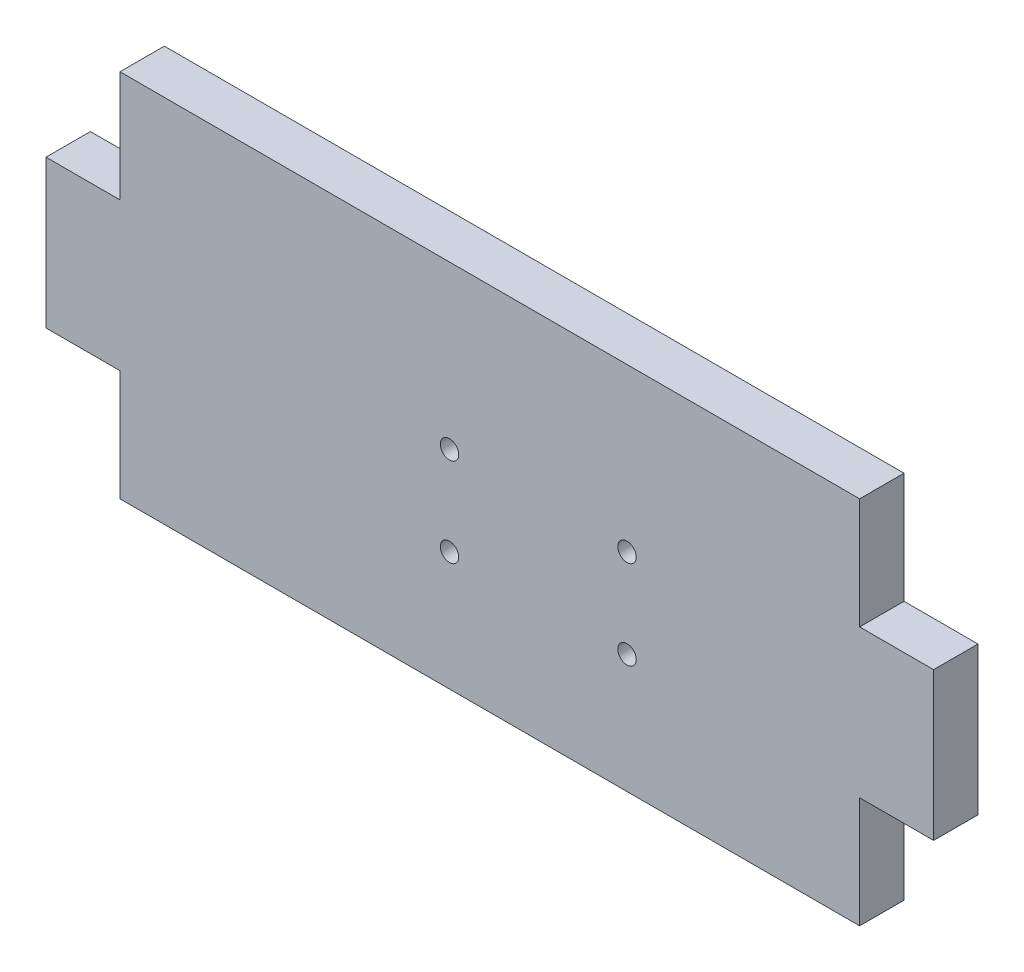
ISO-10303-21;
HEADER;
FILE_DESCRIPTION(('STEP AP214'),'2;1');
FILE_NAME('part.step','',(''),(''),'','','');
FILE_SCHEMA(('AUTOMOTIVE_DESIGN { 1 0 10303 214 1 1 1 1 }'));
ENDSEC;
DATA;
#1=APPLICATION_CONTEXT('core data for automotive mechanical design processes');
#2=APPLICATION_PROTOCOL_DEFINITION('international standard','automotive_design',2000,#1);
#3=PRODUCT_CONTEXT('',#1,'mechanical');
#4=PRODUCT('Part','Part','',(#3));
#5=PRODUCT_RELATED_PRODUCT_CATEGORY('part','',(#4));
#6=PRODUCT_DEFINITION_FORMATION('','',#4);
#7=PRODUCT_DEFINITION_CONTEXT('part definition',#1,'design');
#8=PRODUCT_DEFINITION('design','',#6,#7);
#9=PRODUCT_DEFINITION_SHAPE('','',#8);
#10=(LENGTH_UNIT() NAMED_UNIT(*) SI_UNIT(.MILLI.,.METRE.));
#11=(NAMED_UNIT(*) PLANE_ANGLE_UNIT() SI_UNIT($,.RADIAN.));
#12=(NAMED_UNIT(*) SI_UNIT($,.STERADIAN.) SOLID_ANGLE_UNIT());
#13=UNCERTAINTY_MEASURE_WITH_UNIT(LENGTH_MEASURE(1.E-05),#10,'distance_accuracy_value','');
#14=(GEOMETRIC_REPRESENTATION_CONTEXT(3) GLOBAL_UNCERTAINTY_ASSIGNED_CONTEXT((#13)) GLOBAL_UNIT_ASSIGNED_CONTEXT((#10,
#11,#12)) REPRESENTATION_CONTEXT('',''));
#15=CARTESIAN_POINT('',(0.,0.,0.));
#16=DIRECTION('',(0.,0.,1.));
#17=DIRECTION('',(1.,0.,0.));
#18=AXIS2_PLACEMENT_3D('',#15,#16,#17);
#19=CARTESIAN_POINT('',(0.,35.,6.));
#20=DIRECTION('',(0.,-1.,0.));
#21=DIRECTION('',(0.,0.,-1.));
#22=AXIS2_PLACEMENT_3D('',#19,#20,#21);
#23=PLANE('',#22);
#24=DIRECTION('',(-1.,0.,0.));
#25=VECTOR('',#24,1.);
#26=CARTESIAN_POINT('',(0.,35.,0.));
#27=LINE('',#26,#25);
#28=CARTESIAN_POINT('',(0.,35.,0.));
#29=VERTEX_POINT('',#28);
#30=CARTESIAN_POINT('',(-10.,35.,0.));
#31=VERTEX_POINT('',#30);
#32=EDGE_CURVE('E163',#29,#31,#27,.T.);
#33=ORIENTED_EDGE('',*,*,#32,.T.);
#34=DIRECTION('',(0.,0.,-1.));
#35=VECTOR('',#34,1.);
#36=CARTESIAN_POINT('',(-10.,35.,6.));
#37=LINE('',#36,#35);
#38=CARTESIAN_POINT('',(-10.,35.,6.));
#39=VERTEX_POINT('',#38);
#40=EDGE_CURVE('E11',#39,#31,#37,.T.);
#41=ORIENTED_EDGE('',*,*,#40,.F.);
#42=DIRECTION('',(-1.,0.,0.));
#43=VECTOR('',#42,1.);
#44=CARTESIAN_POINT('',(0.,35.,6.));
#45=LINE('',#44,#43);
#46=CARTESIAN_POINT('',(0.,35.,6.));
#47=VERTEX_POINT('',#46);
#48=EDGE_CURVE('E227',#47,#39,#45,.T.);
#49=ORIENTED_EDGE('',*,*,#48,.F.);
#50=DIRECTION('',(0.,0.,-1.));
#51=VECTOR('',#50,1.);
#52=CARTESIAN_POINT('',(0.,35.,6.));
#53=LINE('',#52,#51);
#54=EDGE_CURVE('E55',#47,#29,#53,.T.);
#55=ORIENTED_EDGE('',*,*,#54,.T.);
#56=EDGE_LOOP('',(#33,#41,#49,#55));
#57=FACE_BOUND('',#56,.T.);
#58=ADVANCED_FACE('F39',(#57),#23,.F.);
#59=CARTESIAN_POINT('',(-10.,0.,6.));
#60=DIRECTION('',(1.,0.,0.));
#61=DIRECTION('',(0.,1.,0.));
#62=AXIS2_PLACEMENT_3D('',#59,#60,#61);
#63=PLANE('',#62);
#64=DIRECTION('',(0.,-1.,0.));
#65=VECTOR('',#64,1.);
#66=CARTESIAN_POINT('',(-10.,0.,0.));
#67=LINE('',#66,#65);
#68=CARTESIAN_POINT('',(-10.,15.,0.));
#69=VERTEX_POINT('',#68);
#70=EDGE_CURVE('E165',#31,#69,#67,.T.);
#71=ORIENTED_EDGE('',*,*,#70,.T.);
#72=DIRECTION('',(0.,0.,-1.));
#73=VECTOR('',#72,1.);
#74=CARTESIAN_POINT('',(-10.,15.,6.));
#75=LINE('',#74,#73);
#76=CARTESIAN_POINT('',(-10.,15.,6.));
#77=VERTEX_POINT('',#76);
#78=EDGE_CURVE('E47',#77,#69,#75,.T.);
#79=ORIENTED_EDGE('',*,*,#78,.F.);
#80=DIRECTION('',(0.,-1.,0.));
#81=VECTOR('',#80,1.);
#82=CARTESIAN_POINT('',(-10.,0.,6.));
#83=LINE('',#82,#81);
#84=EDGE_CURVE('E105',#39,#77,#83,.T.);
#85=ORIENTED_EDGE('',*,*,#84,.F.);
#86=ORIENTED_EDGE('',*,*,#40,.T.);
#87=EDGE_LOOP('',(#71,#79,#85,#86));
#88=FACE_BOUND('',#87,.T.);
#89=ADVANCED_FACE('F213',(#88),#63,.F.);
#90=CARTESIAN_POINT('',(0.,15.,6.));
#91=DIRECTION('',(0.,-1.,0.));
#92=DIRECTION('',(0.,0.,-1.));
#93=AXIS2_PLACEMENT_3D('',#90,#91,#92);
#94=PLANE('',#93);
#95=DIRECTION('',(-1.,0.,0.));
#96=VECTOR('',#95,1.);
#97=CARTESIAN_POINT('',(0.,15.,0.));
#98=LINE('',#97,#96);
#99=CARTESIAN_POINT('',(0.,15.,0.));
#100=VERTEX_POINT('',#99);
#101=EDGE_CURVE('E169',#100,#69,#98,.T.);
#102=ORIENTED_EDGE('',*,*,#101,.F.);
#103=DIRECTION('',(0.,0.,-1.));
#104=VECTOR('',#103,1.);
#105=CARTESIAN_POINT('',(0.,15.,6.));
#106=LINE('',#105,#104);
#107=CARTESIAN_POINT('',(0.,15.,6.));
#108=VERTEX_POINT('',#107);
#109=EDGE_CURVE('E206',#108,#100,#106,.T.);
#110=ORIENTED_EDGE('',*,*,#109,.F.);
#111=DIRECTION('',(-1.,0.,0.));
#112=VECTOR('',#111,1.);
#113=CARTESIAN_POINT('',(0.,15.,6.));
#114=LINE('',#113,#112);
#115=EDGE_CURVE('E212',#108,#77,#114,.T.);
#116=ORIENTED_EDGE('',*,*,#115,.T.);
#117=ORIENTED_EDGE('',*,*,#78,.T.);
#118=EDGE_LOOP('',(#102,#110,#116,#117));
#119=FACE_BOUND('',#118,.T.);
#120=ADVANCED_FACE('F210',(#119),#94,.T.);
#121=CARTESIAN_POINT('',(0.,0.,6.));
#122=DIRECTION('',(-1.,0.,0.));
#123=DIRECTION('',(0.,0.,1.));
#124=AXIS2_PLACEMENT_3D('',#121,#122,#123);
#125=PLANE('',#124);
#126=DIRECTION('',(0.,1.,0.));
#127=VECTOR('',#126,1.);
#128=CARTESIAN_POINT('',(0.,0.,0.));
#129=LINE('',#128,#127);
#130=CARTESIAN_POINT('',(0.,0.,0.));
#131=VERTEX_POINT('',#130);
#132=EDGE_CURVE('E172',#131,#100,#129,.T.);
#133=ORIENTED_EDGE('',*,*,#132,.F.);
#134=DIRECTION('',(0.,0.,-1.));
#135=VECTOR('',#134,1.);
#136=CARTESIAN_POINT('',(0.,0.,6.));
#137=LINE('',#136,#135);
#138=CARTESIAN_POINT('',(0.,0.,6.));
#139=VERTEX_POINT('',#138);
#140=EDGE_CURVE('E204',#139,#131,#137,.T.);
#141=ORIENTED_EDGE('',*,*,#140,.F.);
#142=DIRECTION('',(0.,1.,0.));
#143=VECTOR('',#142,1.);
#144=CARTESIAN_POINT('',(0.,0.,6.));
#145=LINE('',#144,#143);
#146=EDGE_CURVE('E159',#139,#108,#145,.T.);
#147=ORIENTED_EDGE('',*,*,#146,.T.);
#148=ORIENTED_EDGE('',*,*,#109,.T.);
#149=EDGE_LOOP('',(#133,#141,#147,#148));
#150=FACE_BOUND('',#149,.T.);
#151=ADVANCED_FACE('F221',(#150),#125,.T.);
#152=CARTESIAN_POINT('',(0.,0.,6.));
#153=DIRECTION('',(0.,1.,0.));
#154=DIRECTION('',(0.,0.,1.));
#155=AXIS2_PLACEMENT_3D('',#152,#153,#154);
#156=PLANE('',#155);
#157=DIRECTION('',(1.,0.,0.));
#158=VECTOR('',#157,1.);
#159=CARTESIAN_POINT('',(0.,0.,0.));
#160=LINE('',#159,#158);
#161=CARTESIAN_POINT('',(100.,0.,0.));
#162=VERTEX_POINT('',#161);
#163=EDGE_CURVE('E175',#131,#162,#160,.T.);
#164=ORIENTED_EDGE('',*,*,#163,.T.);
#165=DIRECTION('',(0.,0.,-1.));
#166=VECTOR('',#165,1.);
#167=CARTESIAN_POINT('',(100.,0.,6.));
#168=LINE('',#167,#166);
#169=CARTESIAN_POINT('',(100.,0.,6.));
#170=VERTEX_POINT('',#169);
#171=EDGE_CURVE('E201',#170,#162,#168,.T.);
#172=ORIENTED_EDGE('',*,*,#171,.F.);
#173=DIRECTION('',(1.,0.,0.));
#174=VECTOR('',#173,1.);
#175=CARTESIAN_POINT('',(0.,0.,6.));
#176=LINE('',#175,#174);
#177=EDGE_CURVE('E226',#139,#170,#176,.T.);
#178=ORIENTED_EDGE('',*,*,#177,.F.);
#179=ORIENTED_EDGE('',*,*,#140,.T.);
#180=EDGE_LOOP('',(#164,#172,#178,#179));
#181=FACE_BOUND('',#180,.T.);
#182=ADVANCED_FACE('F300',(#181),#156,.F.);
#183=CARTESIAN_POINT('',(100.,0.,6.));
#184=DIRECTION('',(-1.,0.,0.));
#185=DIRECTION('',(0.,0.,1.));
#186=AXIS2_PLACEMENT_3D('',#183,#184,#185);
#187=PLANE('',#186);
#188=DIRECTION('',(0.,1.,0.));
#189=VECTOR('',#188,1.);
#190=CARTESIAN_POINT('',(100.,0.,0.));
#191=LINE('',#190,#189);
#192=CARTESIAN_POINT('',(100.,15.,0.));
#193=VERTEX_POINT('',#192);
#194=EDGE_CURVE('E178',#162,#193,#191,.T.);
#195=ORIENTED_EDGE('',*,*,#194,.T.);
#196=DIRECTION('',(0.,0.,-1.));
#197=VECTOR('',#196,1.);
#198=CARTESIAN_POINT('',(100.,15.,6.));
#199=LINE('',#198,#197);
#200=CARTESIAN_POINT('',(100.,15.,6.));
#201=VERTEX_POINT('',#200);
#202=EDGE_CURVE('E198',#201,#193,#199,.T.);
#203=ORIENTED_EDGE('',*,*,#202,.F.);
#204=DIRECTION('',(0.,1.,0.));
#205=VECTOR('',#204,1.);
#206=CARTESIAN_POINT('',(100.,0.,6.));
#207=LINE('',#206,#205);
#208=EDGE_CURVE('E145',#170,#201,#207,.T.);
#209=ORIENTED_EDGE('',*,*,#208,.F.);
#210=ORIENTED_EDGE('',*,*,#171,.T.);
#211=EDGE_LOOP('',(#195,#203,#209,#210));
#212=FACE_BOUND('',#211,.T.);
#213=ADVANCED_FACE('F303',(#212),#187,.F.);
#214=CARTESIAN_POINT('',(0.,15.,6.));
#215=DIRECTION('',(0.,1.,0.));
#216=DIRECTION('',(0.,0.,1.));
#217=AXIS2_PLACEMENT_3D('',#214,#215,#216);
#218=PLANE('',#217);
#219=DIRECTION('',(1.,0.,0.));
#220=VECTOR('',#219,1.);
#221=CARTESIAN_POINT('',(0.,15.,0.));
#222=LINE('',#221,#220);
#223=CARTESIAN_POINT('',(110.,15.,0.));
#224=VERTEX_POINT('',#223);
#225=EDGE_CURVE('E180',#193,#224,#222,.T.);
#226=ORIENTED_EDGE('',*,*,#225,.T.);
#227=DIRECTION('',(0.,0.,-1.));
#228=VECTOR('',#227,1.);
#229=CARTESIAN_POINT('',(110.,15.,6.));
#230=LINE('',#229,#228);
#231=CARTESIAN_POINT('',(110.,15.,6.));
#232=VERTEX_POINT('',#231);
#233=EDGE_CURVE('E196',#232,#224,#230,.T.);
#234=ORIENTED_EDGE('',*,*,#233,.F.);
#235=DIRECTION('',(1.,0.,0.));
#236=VECTOR('',#235,1.);
#237=CARTESIAN_POINT('',(0.,15.,6.));
#238=LINE('',#237,#236);
#239=EDGE_CURVE('E232',#201,#232,#238,.T.);
#240=ORIENTED_EDGE('',*,*,#239,.F.);
#241=ORIENTED_EDGE('',*,*,#202,.T.);
#242=EDGE_LOOP('',(#226,#234,#240,#241));
#243=FACE_BOUND('',#242,.T.);
#244=ADVANCED_FACE('F305',(#243),#218,.F.);
#245=CARTESIAN_POINT('',(110.,0.,6.));
#246=DIRECTION('',(1.,0.,0.));
#247=DIRECTION('',(0.,0.,-1.));
#248=AXIS2_PLACEMENT_3D('',#245,#246,#247);
#249=PLANE('',#248);
#250=DIRECTION('',(0.,-1.,0.));
#251=VECTOR('',#250,1.);
#252=CARTESIAN_POINT('',(110.,0.,0.));
#253=LINE('',#252,#251);
#254=CARTESIAN_POINT('',(110.,35.,0.));
#255=VERTEX_POINT('',#254);
#256=EDGE_CURVE('E183',#255,#224,#253,.T.);
#257=ORIENTED_EDGE('',*,*,#256,.F.);
#258=DIRECTION('',(0.,0.,-1.));
#259=VECTOR('',#258,1.);
#260=CARTESIAN_POINT('',(110.,35.,6.));
#261=LINE('',#260,#259);
#262=CARTESIAN_POINT('',(110.,35.,6.));
#263=VERTEX_POINT('',#262);
#264=EDGE_CURVE('E194',#263,#255,#261,.T.);
#265=ORIENTED_EDGE('',*,*,#264,.F.);
#266=DIRECTION('',(0.,-1.,0.));
#267=VECTOR('',#266,1.);
#268=CARTESIAN_POINT('',(110.,0.,6.));
#269=LINE('',#268,#267);
#270=EDGE_CURVE('E233',#263,#232,#269,.T.);
#271=ORIENTED_EDGE('',*,*,#270,.T.);
#272=ORIENTED_EDGE('',*,*,#233,.T.);
#273=EDGE_LOOP('',(#257,#265,#271,#272));
#274=FACE_BOUND('',#273,.T.);
#275=ADVANCED_FACE('F308',(#274),#249,.T.);
#276=CARTESIAN_POINT('',(0.,35.,6.));
#277=DIRECTION('',(0.,1.,0.));
#278=DIRECTION('',(0.,0.,1.));
#279=AXIS2_PLACEMENT_3D('',#276,#277,#278);
#280=PLANE('',#279);
#281=DIRECTION('',(1.,0.,0.));
#282=VECTOR('',#281,1.);
#283=CARTESIAN_POINT('',(0.,35.,0.));
#284=LINE('',#283,#282);
#285=CARTESIAN_POINT('',(100.,35.,0.));
#286=VERTEX_POINT('',#285);
#287=EDGE_CURVE('E186',#286,#255,#284,.T.);
#288=ORIENTED_EDGE('',*,*,#287,.F.);
#289=DIRECTION('',(0.,0.,-1.));
#290=VECTOR('',#289,1.);
#291=CARTESIAN_POINT('',(100.,35.,6.));
#292=LINE('',#291,#290);
#293=CARTESIAN_POINT('',(100.,35.,6.));
#294=VERTEX_POINT('',#293);
#295=EDGE_CURVE('E153',#294,#286,#292,.T.);
#296=ORIENTED_EDGE('',*,*,#295,.F.);
#297=DIRECTION('',(1.,0.,0.));
#298=VECTOR('',#297,1.);
#299=CARTESIAN_POINT('',(0.,35.,6.));
#300=LINE('',#299,#298);
#301=EDGE_CURVE('E142',#294,#263,#300,.T.);
#302=ORIENTED_EDGE('',*,*,#301,.T.);
#303=ORIENTED_EDGE('',*,*,#264,.T.);
#304=EDGE_LOOP('',(#288,#296,#302,#303));
#305=FACE_BOUND('',#304,.T.);
#306=ADVANCED_FACE('F238',(#305),#280,.T.);
#307=CARTESIAN_POINT('',(100.,50.,0.));
#308=VERTEX_POINT('',#307);
#309=EDGE_CURVE('E150',#286,#308,#191,.T.);
#310=ORIENTED_EDGE('',*,*,#309,.T.);
#311=DIRECTION('',(0.,0.,-1.));
#312=VECTOR('',#311,1.);
#313=CARTESIAN_POINT('',(100.,50.,6.));
#314=LINE('',#313,#312);
#315=CARTESIAN_POINT('',(100.,50.,6.));
#316=VERTEX_POINT('',#315);
#317=EDGE_CURVE('E147',#316,#308,#314,.T.);
#318=ORIENTED_EDGE('',*,*,#317,.F.);
#319=EDGE_CURVE('E134',#294,#316,#207,.T.);
#320=ORIENTED_EDGE('',*,*,#319,.F.);
#321=ORIENTED_EDGE('',*,*,#295,.T.);
#322=EDGE_LOOP('',(#310,#318,#320,#321));
#323=FACE_BOUND('',#322,.T.);
#324=ADVANCED_FACE('F148',(#323),#187,.F.);
#325=CARTESIAN_POINT('',(0.,50.,6.));
#326=DIRECTION('',(0.,1.,0.));
#327=DIRECTION('',(0.,0.,1.));
#328=AXIS2_PLACEMENT_3D('',#325,#326,#327);
#329=PLANE('',#328);
#330=DIRECTION('',(1.,0.,0.));
#331=VECTOR('',#330,1.);
#332=CARTESIAN_POINT('',(0.,50.,0.));
#333=LINE('',#332,#331);
#334=CARTESIAN_POINT('',(0.,50.,0.));
#335=VERTEX_POINT('',#334);
#336=EDGE_CURVE('E189',#335,#308,#333,.T.);
#337=ORIENTED_EDGE('',*,*,#336,.F.);
#338=DIRECTION('',(0.,0.,-1.));
#339=VECTOR('',#338,1.);
#340=CARTESIAN_POINT('',(0.,50.,6.));
#341=LINE('',#340,#339);
#342=CARTESIAN_POINT('',(0.,50.,6.));
#343=VERTEX_POINT('',#342);
#344=EDGE_CURVE('E93',#343,#335,#341,.T.);
#345=ORIENTED_EDGE('',*,*,#344,.F.);
#346=DIRECTION('',(1.,0.,0.));
#347=VECTOR('',#346,1.);
#348=CARTESIAN_POINT('',(0.,50.,6.));
#349=LINE('',#348,#347);
#350=EDGE_CURVE('E139',#343,#316,#349,.T.);
#351=ORIENTED_EDGE('',*,*,#350,.T.);
#352=ORIENTED_EDGE('',*,*,#317,.T.);
#353=EDGE_LOOP('',(#337,#345,#351,#352));
#354=FACE_BOUND('',#353,.T.);
#355=ADVANCED_FACE('F155',(#354),#329,.T.);
#356=EDGE_CURVE('E176',#29,#335,#129,.T.);
#357=ORIENTED_EDGE('',*,*,#356,.F.);
#358=ORIENTED_EDGE('',*,*,#54,.F.);
#359=EDGE_CURVE('E156',#47,#343,#145,.T.);
#360=ORIENTED_EDGE('',*,*,#359,.T.);
#361=ORIENTED_EDGE('',*,*,#344,.T.);
#362=EDGE_LOOP('',(#357,#358,#360,#361));
#363=FACE_BOUND('',#362,.T.);
#364=ADVANCED_FACE('F282',(#363),#125,.T.);
#365=CARTESIAN_POINT('',(0.,0.,6.));
#366=DIRECTION('',(0.,0.,1.));
#367=DIRECTION('',(1.,0.,0.));
#368=AXIS2_PLACEMENT_3D('',#365,#366,#367);
#369=PLANE('',#368);
#370=CARTESIAN_POINT('',(68.550340057059,16.0653133446784,6.));
#371=DIRECTION('',(0.,0.,1.));
#372=DIRECTION('',(1.,0.,0.));
#373=AXIS2_PLACEMENT_3D('',#370,#371,#372);
#374=CIRCLE('',#373,1.25);
#375=CARTESIAN_POINT('',(69.800340057059,16.0653133446784,6.));
#376=VERTEX_POINT('',#375);
#377=EDGE_CURVE('E248',#376,#376,#374,.F.);
#378=ORIENTED_EDGE('',*,*,#377,.T.);
#379=EDGE_LOOP('',(#378));
#380=FACE_BOUND('',#379,.T.);
#381=CARTESIAN_POINT('',(68.550340057059,28.0653133446784,6.));
#382=DIRECTION('',(0.,0.,1.));
#383=DIRECTION('',(1.,0.,0.));
#384=AXIS2_PLACEMENT_3D('',#381,#382,#383);
#385=CIRCLE('',#384,1.25);
#386=CARTESIAN_POINT('',(69.800340057059,28.0653133446784,6.));
#387=VERTEX_POINT('',#386);
#388=EDGE_CURVE('E255',#387,#387,#385,.F.);
#389=ORIENTED_EDGE('',*,*,#388,.T.);
#390=EDGE_LOOP('',(#389));
#391=FACE_BOUND('',#390,.T.);
#392=CARTESIAN_POINT('',(44.550340057059,28.0653133446784,6.));
#393=DIRECTION('',(0.,0.,1.));
#394=DIRECTION('',(1.,0.,0.));
#395=AXIS2_PLACEMENT_3D('',#392,#393,#394);
#396=CIRCLE('',#395,1.25);
#397=CARTESIAN_POINT('',(45.800340057059,28.0653133446784,6.));
#398=VERTEX_POINT('',#397);
#399=EDGE_CURVE('E247',#398,#398,#396,.F.);
#400=ORIENTED_EDGE('',*,*,#399,.T.);
#401=EDGE_LOOP('',(#400));
#402=FACE_BOUND('',#401,.T.);
#403=CARTESIAN_POINT('',(44.550340057059,16.0653133446784,6.));
#404=DIRECTION('',(0.,0.,1.));
#405=DIRECTION('',(1.,0.,0.));
#406=AXIS2_PLACEMENT_3D('',#403,#404,#405);
#407=CIRCLE('',#406,1.25);
#408=CARTESIAN_POINT('',(45.800340057059,16.0653133446784,6.));
#409=VERTEX_POINT('',#408);
#410=EDGE_CURVE('E166',#409,#409,#407,.F.);
#411=ORIENTED_EDGE('',*,*,#410,.T.);
#412=EDGE_LOOP('',(#411));
#413=FACE_BOUND('',#412,.T.);
#414=ORIENTED_EDGE('',*,*,#48,.T.);
#415=ORIENTED_EDGE('',*,*,#84,.T.);
#416=ORIENTED_EDGE('',*,*,#115,.F.);
#417=ORIENTED_EDGE('',*,*,#146,.F.);
#418=ORIENTED_EDGE('',*,*,#177,.T.);
#419=ORIENTED_EDGE('',*,*,#208,.T.);
#420=ORIENTED_EDGE('',*,*,#239,.T.);
#421=ORIENTED_EDGE('',*,*,#270,.F.);
#422=ORIENTED_EDGE('',*,*,#301,.F.);
#423=ORIENTED_EDGE('',*,*,#319,.T.);
#424=ORIENTED_EDGE('',*,*,#350,.F.);
#425=ORIENTED_EDGE('',*,*,#359,.F.);
#426=EDGE_LOOP('',(#414,#415,#416,#417,#418,#419,#420,#421,#422,#423,#424,#425));
#427=FACE_BOUND('',#426,.T.);
#428=ADVANCED_FACE('F136',(#380,#391,#402,#413,#427),#369,.T.);
#429=CARTESIAN_POINT('',(0.,0.,0.));
#430=DIRECTION('',(0.,0.,1.));
#431=DIRECTION('',(1.,0.,0.));
#432=AXIS2_PLACEMENT_3D('',#429,#430,#431);
#433=PLANE('',#432);
#434=CARTESIAN_POINT('',(68.550340057059,16.0653133446784,0.));
#435=DIRECTION('',(0.,0.,-1.));
#436=DIRECTION('',(-1.,0.,0.));
#437=AXIS2_PLACEMENT_3D('',#434,#435,#436);
#438=CIRCLE('',#437,1.25);
#439=CARTESIAN_POINT('',(67.300340057059,16.0653133446784,0.));
#440=VERTEX_POINT('',#439);
#441=EDGE_CURVE('E252',#440,#440,#438,.T.);
#442=ORIENTED_EDGE('',*,*,#441,.F.);
#443=EDGE_LOOP('',(#442));
#444=FACE_BOUND('',#443,.T.);
#445=CARTESIAN_POINT('',(68.550340057059,28.0653133446784,0.));
#446=DIRECTION('',(0.,0.,-1.));
#447=DIRECTION('',(-1.,0.,0.));
#448=AXIS2_PLACEMENT_3D('',#445,#446,#447);
#449=CIRCLE('',#448,1.25);
#450=CARTESIAN_POINT('',(67.300340057059,28.0653133446784,0.));
#451=VERTEX_POINT('',#450);
#452=EDGE_CURVE('E251',#451,#451,#449,.T.);
#453=ORIENTED_EDGE('',*,*,#452,.F.);
#454=EDGE_LOOP('',(#453));
#455=FACE_BOUND('',#454,.T.);
#456=CARTESIAN_POINT('',(44.550340057059,28.0653133446784,0.));
#457=DIRECTION('',(0.,0.,-1.));
#458=DIRECTION('',(-1.,0.,0.));
#459=AXIS2_PLACEMENT_3D('',#456,#457,#458);
#460=CIRCLE('',#459,1.25);
#461=CARTESIAN_POINT('',(43.300340057059,28.0653133446784,0.));
#462=VERTEX_POINT('',#461);
#463=EDGE_CURVE('E258',#462,#462,#460,.T.);
#464=ORIENTED_EDGE('',*,*,#463,.F.);
#465=EDGE_LOOP('',(#464));
#466=FACE_BOUND('',#465,.T.);
#467=CARTESIAN_POINT('',(44.550340057059,16.0653133446784,0.));
#468=DIRECTION('',(0.,0.,-1.));
#469=DIRECTION('',(-1.,0.,0.));
#470=AXIS2_PLACEMENT_3D('',#467,#468,#469);
#471=CIRCLE('',#470,1.25);
#472=CARTESIAN_POINT('',(43.300340057059,16.0653133446784,0.));
#473=VERTEX_POINT('',#472);
#474=EDGE_CURVE('E244',#473,#473,#471,.T.);
#475=ORIENTED_EDGE('',*,*,#474,.F.);
#476=EDGE_LOOP('',(#475));
#477=FACE_BOUND('',#476,.T.);
#478=ORIENTED_EDGE('',*,*,#32,.F.);
#479=ORIENTED_EDGE('',*,*,#356,.T.);
#480=ORIENTED_EDGE('',*,*,#336,.T.);
#481=ORIENTED_EDGE('',*,*,#309,.F.);
#482=ORIENTED_EDGE('',*,*,#287,.T.);
#483=ORIENTED_EDGE('',*,*,#256,.T.);
#484=ORIENTED_EDGE('',*,*,#225,.F.);
#485=ORIENTED_EDGE('',*,*,#194,.F.);
#486=ORIENTED_EDGE('',*,*,#163,.F.);
#487=ORIENTED_EDGE('',*,*,#132,.T.);
#488=ORIENTED_EDGE('',*,*,#101,.T.);
#489=ORIENTED_EDGE('',*,*,#70,.F.);
#490=EDGE_LOOP('',(#478,#479,#480,#481,#482,#483,#484,#485,#486,#487,#488,#489));
#491=FACE_BOUND('',#490,.T.);
#492=ADVANCED_FACE('F216',(#444,#455,#466,#477,#491),#433,.F.);
#493=CARTESIAN_POINT('',(44.550340057059,16.0653133446784,9.53553390593276));
#494=DIRECTION('',(0.,0.,-1.));
#495=DIRECTION('',(-1.,0.,0.));
#496=AXIS2_PLACEMENT_3D('',#493,#494,#495);
#497=CYLINDRICAL_SURFACE('',#496,1.25);
#498=ORIENTED_EDGE('',*,*,#474,.T.);
#499=EDGE_LOOP('',(#498));
#500=FACE_BOUND('',#499,.T.);
#501=ORIENTED_EDGE('',*,*,#410,.F.);
#502=EDGE_LOOP('',(#501));
#503=FACE_BOUND('',#502,.T.);
#504=ADVANCED_FACE('F271',(#500,#503),#497,.F.);
#505=CARTESIAN_POINT('',(44.550340057059,28.0653133446784,9.53553390593276));
#506=DIRECTION('',(0.,0.,-1.));
#507=DIRECTION('',(-1.,0.,0.));
#508=AXIS2_PLACEMENT_3D('',#505,#506,#507);
#509=CYLINDRICAL_SURFACE('',#508,1.25);
#510=ORIENTED_EDGE('',*,*,#463,.T.);
#511=EDGE_LOOP('',(#510));
#512=FACE_BOUND('',#511,.T.);
#513=ORIENTED_EDGE('',*,*,#399,.F.);
#514=EDGE_LOOP('',(#513));
#515=FACE_BOUND('',#514,.T.);
#516=ADVANCED_FACE('F266',(#512,#515),#509,.F.);
#517=CARTESIAN_POINT('',(68.550340057059,28.0653133446784,9.53553390593276));
#518=DIRECTION('',(0.,0.,-1.));
#519=DIRECTION('',(-1.,0.,0.));
#520=AXIS2_PLACEMENT_3D('',#517,#518,#519);
#521=CYLINDRICAL_SURFACE('',#520,1.25);
#522=ORIENTED_EDGE('',*,*,#452,.T.);
#523=EDGE_LOOP('',(#522));
#524=FACE_BOUND('',#523,.T.);
#525=ORIENTED_EDGE('',*,*,#388,.F.);
#526=EDGE_LOOP('',(#525));
#527=FACE_BOUND('',#526,.T.);
#528=ADVANCED_FACE('F347',(#524,#527),#521,.F.);
#529=CARTESIAN_POINT('',(68.550340057059,16.0653133446784,9.53553390593276));
#530=DIRECTION('',(0.,0.,-1.));
#531=DIRECTION('',(-1.,0.,0.));
#532=AXIS2_PLACEMENT_3D('',#529,#530,#531);
#533=CYLINDRICAL_SURFACE('',#532,1.25);
#534=ORIENTED_EDGE('',*,*,#441,.T.);
#535=EDGE_LOOP('',(#534));
#536=FACE_BOUND('',#535,.T.);
#537=ORIENTED_EDGE('',*,*,#377,.F.);
#538=EDGE_LOOP('',(#537));
#539=FACE_BOUND('',#538,.T.);
#540=ADVANCED_FACE('F354',(#536,#539),#533,.F.);
#541=CLOSED_SHELL('',(#58,#89,#120,#151,#182,#213,#244,#275,#306,#324,#355,#364,#428,#492,#504,
#516,#528,#540));
#542=MANIFOLD_SOLID_BREP('B2',#541);
#543=ADVANCED_BREP_SHAPE_REPRESENTATION('',(#18,#542),#14);
#544=SHAPE_DEFINITION_REPRESENTATION(#9,#543);
ENDSEC;
END-ISO-10303-21;
